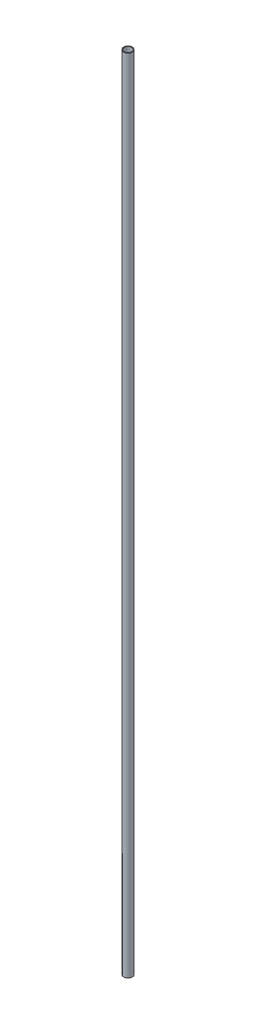
ISO-10303-21;
HEADER;
FILE_DESCRIPTION(('STEP AP214'),'2;1');
FILE_NAME('part.step','',(''),(''),'','','');
FILE_SCHEMA(('AUTOMOTIVE_DESIGN { 1 0 10303 214 1 1 1 1 }'));
ENDSEC;
DATA;
#1=APPLICATION_CONTEXT('core data for automotive mechanical design processes');
#2=APPLICATION_PROTOCOL_DEFINITION('international standard','automotive_design',2000,#1);
#3=PRODUCT_CONTEXT('',#1,'mechanical');
#4=PRODUCT('Part','Part','',(#3));
#5=PRODUCT_RELATED_PRODUCT_CATEGORY('part','',(#4));
#6=PRODUCT_DEFINITION_FORMATION('','',#4);
#7=PRODUCT_DEFINITION_CONTEXT('part definition',#1,'design');
#8=PRODUCT_DEFINITION('design','',#6,#7);
#9=PRODUCT_DEFINITION_SHAPE('','',#8);
#10=(LENGTH_UNIT() NAMED_UNIT(*) SI_UNIT(.MILLI.,.METRE.));
#11=(NAMED_UNIT(*) PLANE_ANGLE_UNIT() SI_UNIT($,.RADIAN.));
#12=(NAMED_UNIT(*) SI_UNIT($,.STERADIAN.) SOLID_ANGLE_UNIT());
#13=UNCERTAINTY_MEASURE_WITH_UNIT(LENGTH_MEASURE(1.E-05),#10,'distance_accuracy_value','');
#14=(GEOMETRIC_REPRESENTATION_CONTEXT(3) GLOBAL_UNCERTAINTY_ASSIGNED_CONTEXT((#13)) GLOBAL_UNIT_ASSIGNED_CONTEXT((#10,
#11,#12)) REPRESENTATION_CONTEXT('',''));
#15=CARTESIAN_POINT('',(0.,0.,0.));
#16=DIRECTION('',(0.,0.,1.));
#17=DIRECTION('',(1.,0.,0.));
#18=AXIS2_PLACEMENT_3D('',#15,#16,#17);
#19=CARTESIAN_POINT('',(-365.791951824706,2470.1142721074,-416.239599383585));
#20=DIRECTION('',(0.,1.,0.));
#21=DIRECTION('',(0.,0.,1.));
#22=AXIS2_PLACEMENT_3D('',#19,#20,#21);
#23=PLANE('',#22);
#24=CARTESIAN_POINT('',(-365.791951824706,2470.1142721074,-416.239599383585));
#25=DIRECTION('',(0.,1.,0.));
#26=DIRECTION('',(0.,0.,1.));
#27=AXIS2_PLACEMENT_3D('',#24,#25,#26);
#28=CIRCLE('',#27,17.4625);
#29=CARTESIAN_POINT('',(-365.791951824706,2470.1142721074,-398.777099383585));
#30=VERTEX_POINT('',#29);
#31=EDGE_CURVE('E10',#30,#30,#28,.T.);
#32=ORIENTED_EDGE('',*,*,#31,.T.);
#33=EDGE_LOOP('',(#32));
#34=FACE_BOUND('',#33,.T.);
#35=CARTESIAN_POINT('',(-365.791951824706,2470.1142721074,-416.239599383585));
#36=DIRECTION('',(0.,1.,0.));
#37=DIRECTION('',(0.,0.,1.));
#38=AXIS2_PLACEMENT_3D('',#35,#36,#37);
#39=CIRCLE('',#38,14.9225);
#40=CARTESIAN_POINT('',(-365.791951824706,2470.1142721074,-401.317099383585));
#41=VERTEX_POINT('',#40);
#42=EDGE_CURVE('E48',#41,#41,#39,.T.);
#43=ORIENTED_EDGE('',*,*,#42,.F.);
#44=EDGE_LOOP('',(#43));
#45=FACE_BOUND('',#44,.T.);
#46=ADVANCED_FACE('F37',(#34,#45),#23,.T.);
#47=CARTESIAN_POINT('',(-365.791951824706,-730.285727892602,-416.239599383585));
#48=DIRECTION('',(0.,1.,0.));
#49=DIRECTION('',(0.,0.,1.));
#50=AXIS2_PLACEMENT_3D('',#47,#48,#49);
#51=PLANE('',#50);
#52=CARTESIAN_POINT('',(-365.791951824706,-730.285727892602,-416.239599383585));
#53=DIRECTION('',(0.,1.,0.));
#54=DIRECTION('',(0.,0.,1.));
#55=AXIS2_PLACEMENT_3D('',#52,#53,#54);
#56=CIRCLE('',#55,17.4625);
#57=CARTESIAN_POINT('',(-365.791951824706,-730.285727892602,-398.777099383585));
#58=VERTEX_POINT('',#57);
#59=EDGE_CURVE('E41',#58,#58,#56,.T.);
#60=ORIENTED_EDGE('',*,*,#59,.F.);
#61=EDGE_LOOP('',(#60));
#62=FACE_BOUND('',#61,.T.);
#63=CARTESIAN_POINT('',(-365.791951824706,-730.285727892602,-416.239599383585));
#64=DIRECTION('',(0.,1.,0.));
#65=DIRECTION('',(0.,0.,1.));
#66=AXIS2_PLACEMENT_3D('',#63,#64,#65);
#67=CIRCLE('',#66,14.9225);
#68=CARTESIAN_POINT('',(-365.791951824706,-730.285727892602,-401.317099383585));
#69=VERTEX_POINT('',#68);
#70=EDGE_CURVE('E50',#69,#69,#67,.T.);
#71=ORIENTED_EDGE('',*,*,#70,.T.);
#72=EDGE_LOOP('',(#71));
#73=FACE_BOUND('',#72,.T.);
#74=ADVANCED_FACE('F60',(#62,#73),#51,.F.);
#75=CARTESIAN_POINT('',(-365.791951824706,2470.1142721074,-416.239599383585));
#76=DIRECTION('',(0.,-1.,0.));
#77=DIRECTION('',(0.,0.,-1.));
#78=AXIS2_PLACEMENT_3D('',#75,#76,#77);
#79=CYLINDRICAL_SURFACE('',#78,17.4625);
#80=ORIENTED_EDGE('',*,*,#31,.F.);
#81=EDGE_LOOP('',(#80));
#82=FACE_BOUND('',#81,.T.);
#83=ORIENTED_EDGE('',*,*,#59,.T.);
#84=EDGE_LOOP('',(#83));
#85=FACE_BOUND('',#84,.T.);
#86=ADVANCED_FACE('F39',(#82,#85),#79,.T.);
#87=CARTESIAN_POINT('',(-365.791951824706,2470.1142721074,-416.239599383585));
#88=DIRECTION('',(0.,-1.,0.));
#89=DIRECTION('',(0.,0.,-1.));
#90=AXIS2_PLACEMENT_3D('',#87,#88,#89);
#91=CYLINDRICAL_SURFACE('',#90,14.9225);
#92=ORIENTED_EDGE('',*,*,#42,.T.);
#93=EDGE_LOOP('',(#92));
#94=FACE_BOUND('',#93,.T.);
#95=ORIENTED_EDGE('',*,*,#70,.F.);
#96=EDGE_LOOP('',(#95));
#97=FACE_BOUND('',#96,.T.);
#98=ADVANCED_FACE('F56',(#94,#97),#91,.F.);
#99=CLOSED_SHELL('',(#46,#74,#86,#98));
#100=MANIFOLD_SOLID_BREP('B2',#99);
#101=ADVANCED_BREP_SHAPE_REPRESENTATION('',(#18,#100),#14);
#102=SHAPE_DEFINITION_REPRESENTATION(#9,#101);
ENDSEC;
END-ISO-10303-21;
